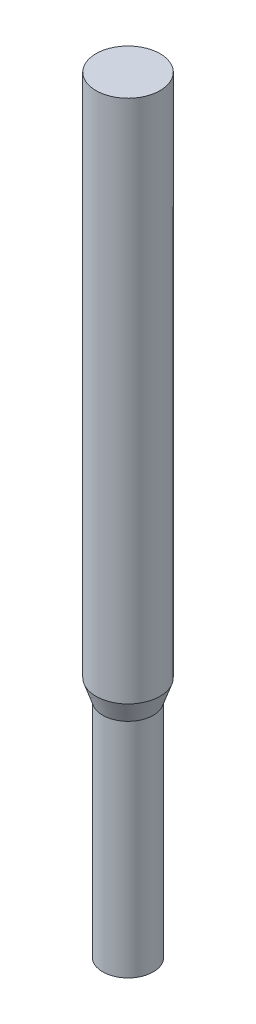
ISO-10303-21;
HEADER;
FILE_DESCRIPTION(('STEP AP214'),'2;1');
FILE_NAME('part.step','',(''),(''),'','','');
FILE_SCHEMA(('AUTOMOTIVE_DESIGN { 1 0 10303 214 1 1 1 1 }'));
ENDSEC;
DATA;
#1=APPLICATION_CONTEXT('core data for automotive mechanical design processes');
#2=APPLICATION_PROTOCOL_DEFINITION('international standard','automotive_design',2000,#1);
#3=PRODUCT_CONTEXT('',#1,'mechanical');
#4=PRODUCT('Part','Part','',(#3));
#5=PRODUCT_RELATED_PRODUCT_CATEGORY('part','',(#4));
#6=PRODUCT_DEFINITION_FORMATION('','',#4);
#7=PRODUCT_DEFINITION_CONTEXT('part definition',#1,'design');
#8=PRODUCT_DEFINITION('design','',#6,#7);
#9=PRODUCT_DEFINITION_SHAPE('','',#8);
#10=(LENGTH_UNIT() NAMED_UNIT(*) SI_UNIT(.MILLI.,.METRE.));
#11=(NAMED_UNIT(*) PLANE_ANGLE_UNIT() SI_UNIT($,.RADIAN.));
#12=(NAMED_UNIT(*) SI_UNIT($,.STERADIAN.) SOLID_ANGLE_UNIT());
#13=UNCERTAINTY_MEASURE_WITH_UNIT(LENGTH_MEASURE(1.E-05),#10,'distance_accuracy_value','');
#14=(GEOMETRIC_REPRESENTATION_CONTEXT(3) GLOBAL_UNCERTAINTY_ASSIGNED_CONTEXT((#13)) GLOBAL_UNIT_ASSIGNED_CONTEXT((#10,
#11,#12)) REPRESENTATION_CONTEXT('',''));
#15=CARTESIAN_POINT('',(0.,0.,0.));
#16=DIRECTION('',(0.,0.,1.));
#17=DIRECTION('',(1.,0.,0.));
#18=AXIS2_PLACEMENT_3D('',#15,#16,#17);
#19=CARTESIAN_POINT('',(0.,0.,0.));
#20=DIRECTION('',(0.,-1.,0.));
#21=DIRECTION('',(0.,0.,-1.));
#22=AXIS2_PLACEMENT_3D('',#19,#20,#21);
#23=PLANE('',#22);
#24=CARTESIAN_POINT('',(0.,0.,0.));
#25=DIRECTION('',(0.,-1.,0.));
#26=DIRECTION('',(0.,0.,-1.));
#27=AXIS2_PLACEMENT_3D('',#24,#25,#26);
#28=CIRCLE('',#27,1.5875);
#29=CARTESIAN_POINT('',(0.,0.,-1.5875));
#30=VERTEX_POINT('',#29);
#31=EDGE_CURVE('E10',#30,#30,#28,.T.);
#32=ORIENTED_EDGE('',*,*,#31,.F.);
#33=EDGE_LOOP('',(#32));
#34=FACE_BOUND('',#33,.T.);
#35=ADVANCED_FACE('F33',(#34),#23,.F.);
#36=CARTESIAN_POINT('',(0.,-38.,0.));
#37=DIRECTION('',(0.,-1.,0.));
#38=DIRECTION('',(0.,0.,-1.));
#39=AXIS2_PLACEMENT_3D('',#36,#37,#38);
#40=CYLINDRICAL_SURFACE('',#39,1.5875);
#41=CARTESIAN_POINT('',(0.,-26.,0.));
#42=DIRECTION('',(0.,-1.,0.));
#43=DIRECTION('',(0.,0.,-1.));
#44=AXIS2_PLACEMENT_3D('',#41,#42,#43);
#45=CIRCLE('',#44,1.5875);
#46=CARTESIAN_POINT('',(0.,-26.,-1.5875));
#47=VERTEX_POINT('',#46);
#48=EDGE_CURVE('E39',#47,#47,#45,.T.);
#49=ORIENTED_EDGE('',*,*,#48,.F.);
#50=EDGE_LOOP('',(#49));
#51=FACE_BOUND('',#50,.T.);
#52=ORIENTED_EDGE('',*,*,#31,.T.);
#53=EDGE_LOOP('',(#52));
#54=FACE_BOUND('',#53,.T.);
#55=ADVANCED_FACE('F63',(#51,#54),#40,.T.);
#56=CARTESIAN_POINT('',(0.,-26.,0.));
#57=DIRECTION('',(0.,1.,0.));
#58=DIRECTION('',(0.,0.,1.));
#59=AXIS2_PLACEMENT_3D('',#56,#57,#58);
#60=CONICAL_SURFACE('',#59,1.5875,0.330448933391721);
#61=CARTESIAN_POINT('',(0.,-26.9838888608922,0.));
#62=DIRECTION('',(0.,-1.,0.));
#63=DIRECTION('',(0.,0.,-1.));
#64=AXIS2_PLACEMENT_3D('',#61,#62,#63);
#65=CIRCLE('',#64,1.25);
#66=CARTESIAN_POINT('',(0.,-26.9838888608922,-1.25));
#67=VERTEX_POINT('',#66);
#68=EDGE_CURVE('E43',#67,#67,#65,.T.);
#69=ORIENTED_EDGE('',*,*,#68,.F.);
#70=EDGE_LOOP('',(#69));
#71=FACE_BOUND('',#70,.T.);
#72=ORIENTED_EDGE('',*,*,#48,.T.);
#73=EDGE_LOOP('',(#72));
#74=FACE_BOUND('',#73,.T.);
#75=ADVANCED_FACE('F58',(#71,#74),#60,.T.);
#76=CARTESIAN_POINT('',(0.,-38.,0.));
#77=DIRECTION('',(0.,-1.,0.));
#78=DIRECTION('',(0.,0.,-1.));
#79=AXIS2_PLACEMENT_3D('',#76,#77,#78);
#80=CYLINDRICAL_SURFACE('',#79,1.25);
#81=CARTESIAN_POINT('',(0.,-38.,0.));
#82=DIRECTION('',(0.,-1.,0.));
#83=DIRECTION('',(0.,0.,-1.));
#84=AXIS2_PLACEMENT_3D('',#81,#82,#83);
#85=CIRCLE('',#84,1.25);
#86=CARTESIAN_POINT('',(0.,-38.,-1.25));
#87=VERTEX_POINT('',#86);
#88=EDGE_CURVE('E47',#87,#87,#85,.T.);
#89=ORIENTED_EDGE('',*,*,#88,.F.);
#90=EDGE_LOOP('',(#89));
#91=FACE_BOUND('',#90,.T.);
#92=ORIENTED_EDGE('',*,*,#68,.T.);
#93=EDGE_LOOP('',(#92));
#94=FACE_BOUND('',#93,.T.);
#95=ADVANCED_FACE('F55',(#91,#94),#80,.T.);
#96=CARTESIAN_POINT('',(-1.25,-38.,0.));
#97=DIRECTION('',(0.,1.,0.));
#98=DIRECTION('',(0.,0.,1.));
#99=AXIS2_PLACEMENT_3D('',#96,#97,#98);
#100=PLANE('',#99);
#101=ORIENTED_EDGE('',*,*,#88,.T.);
#102=EDGE_LOOP('',(#101));
#103=FACE_BOUND('',#102,.T.);
#104=ADVANCED_FACE('F53',(#103),#100,.F.);
#105=CLOSED_SHELL('',(#35,#55,#75,#95,#104));
#106=MANIFOLD_SOLID_BREP('B2',#105);
#107=ADVANCED_BREP_SHAPE_REPRESENTATION('',(#18,#106),#14);
#108=SHAPE_DEFINITION_REPRESENTATION(#9,#107);
ENDSEC;
END-ISO-10303-21;
